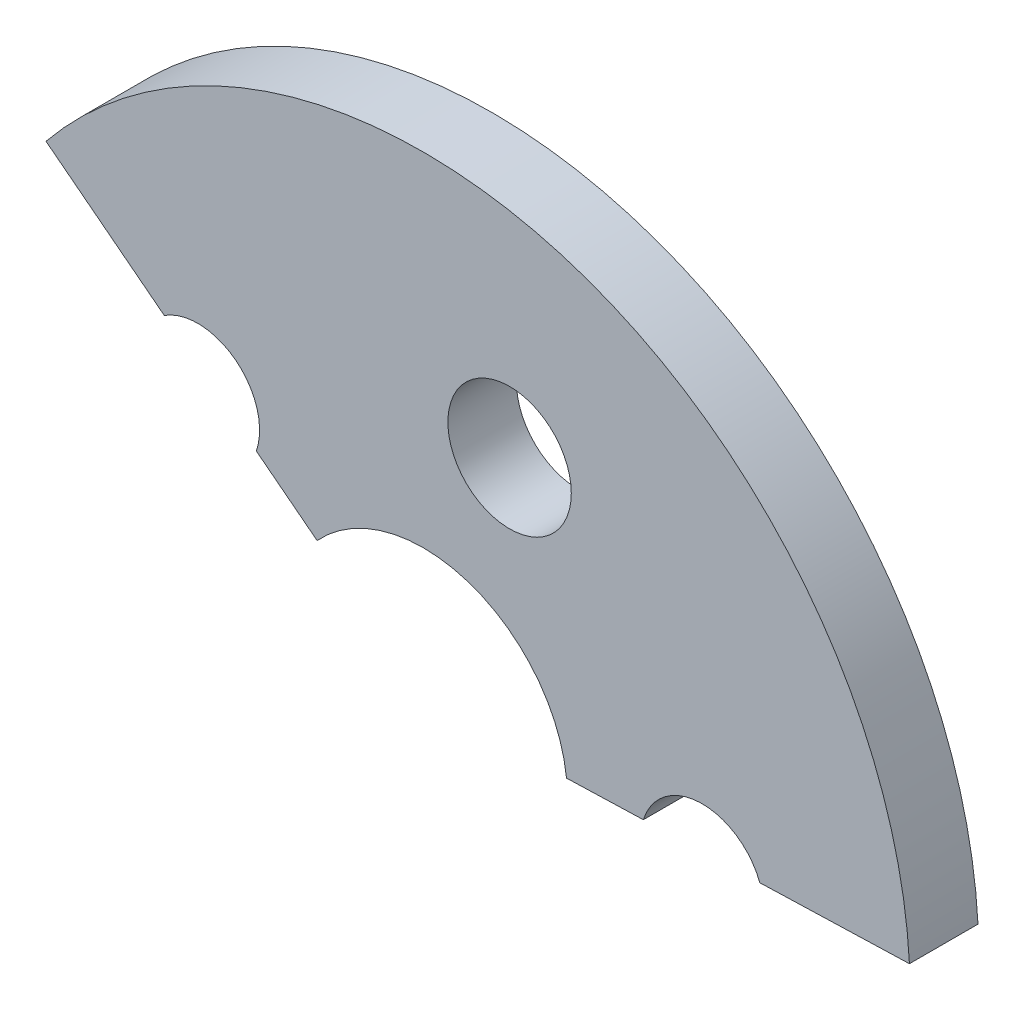
ISO-10303-21;
HEADER;
FILE_DESCRIPTION(('STEP AP214'),'2;1');
FILE_NAME('part.step','',(''),(''),'','','');
FILE_SCHEMA(('AUTOMOTIVE_DESIGN { 1 0 10303 214 1 1 1 1 }'));
ENDSEC;
DATA;
#1=APPLICATION_CONTEXT('core data for automotive mechanical design processes');
#2=APPLICATION_PROTOCOL_DEFINITION('international standard','automotive_design',2000,#1);
#3=PRODUCT_CONTEXT('',#1,'mechanical');
#4=PRODUCT('Part','Part','',(#3));
#5=PRODUCT_RELATED_PRODUCT_CATEGORY('part','',(#4));
#6=PRODUCT_DEFINITION_FORMATION('','',#4);
#7=PRODUCT_DEFINITION_CONTEXT('part definition',#1,'design');
#8=PRODUCT_DEFINITION('design','',#6,#7);
#9=PRODUCT_DEFINITION_SHAPE('','',#8);
#10=(LENGTH_UNIT() NAMED_UNIT(*) SI_UNIT(.MILLI.,.METRE.));
#11=(NAMED_UNIT(*) PLANE_ANGLE_UNIT() SI_UNIT($,.RADIAN.));
#12=(NAMED_UNIT(*) SI_UNIT($,.STERADIAN.) SOLID_ANGLE_UNIT());
#13=UNCERTAINTY_MEASURE_WITH_UNIT(LENGTH_MEASURE(1.E-05),#10,'distance_accuracy_value','');
#14=(GEOMETRIC_REPRESENTATION_CONTEXT(3) GLOBAL_UNCERTAINTY_ASSIGNED_CONTEXT((#13)) GLOBAL_UNIT_ASSIGNED_CONTEXT((#10,
#11,#12)) REPRESENTATION_CONTEXT('',''));
#15=CARTESIAN_POINT('',(0.,0.,0.));
#16=DIRECTION('',(0.,0.,1.));
#17=DIRECTION('',(1.,0.,0.));
#18=AXIS2_PLACEMENT_3D('',#15,#16,#17);
#19=CARTESIAN_POINT('',(45.0166893192371,2.48090865113747,6.35));
#20=DIRECTION('',(-0.0313182896172944,0.999509462053985,0.));
#21=DIRECTION('',(-0.999509462053985,-0.0313182896172945,0.));
#22=AXIS2_PLACEMENT_3D('',#19,#20,#21);
#23=PLANE('',#22);
#24=DIRECTION('',(0.,0.,1.));
#25=VECTOR('',#24,1.);
#26=CARTESIAN_POINT('',(20.3699099311103,1.70863484652068,0.));
#27=LINE('',#26,#25);
#28=CARTESIAN_POINT('',(20.3699099311103,1.70863484652068,0.));
#29=VERTEX_POINT('',#28);
#30=CARTESIAN_POINT('',(20.3699099311103,1.70863484652068,6.35));
#31=VERTEX_POINT('',#30);
#32=EDGE_CURVE('E55',#29,#31,#27,.T.);
#33=ORIENTED_EDGE('',*,*,#32,.T.);
#34=DIRECTION('',(0.999509462053985,0.0313182896172945,0.));
#35=VECTOR('',#34,1.);
#36=CARTESIAN_POINT('',(45.0166893192371,2.48090865113747,6.35));
#37=LINE('',#36,#35);
#38=CARTESIAN_POINT('',(13.2519887109247,1.48560432333908,6.35));
#39=VERTEX_POINT('',#38);
#40=EDGE_CURVE('E195',#39,#31,#37,.T.);
#41=ORIENTED_EDGE('',*,*,#40,.F.);
#42=DIRECTION('',(0.,0.,-1.));
#43=VECTOR('',#42,1.);
#44=CARTESIAN_POINT('',(13.2519887109247,1.48560432333908,6.35));
#45=LINE('',#44,#43);
#46=CARTESIAN_POINT('',(13.2519887109247,1.48560432333908,0.));
#47=VERTEX_POINT('',#46);
#48=EDGE_CURVE('E11',#39,#47,#45,.T.);
#49=ORIENTED_EDGE('',*,*,#48,.T.);
#50=DIRECTION('',(0.999509462053985,0.0313182896172945,0.));
#51=VECTOR('',#50,1.);
#52=CARTESIAN_POINT('',(45.0166893192371,2.48090865113747,0.));
#53=LINE('',#52,#51);
#54=EDGE_CURVE('E134',#47,#29,#53,.T.);
#55=ORIENTED_EDGE('',*,*,#54,.T.);
#56=EDGE_LOOP('',(#33,#41,#49,#55));
#57=FACE_BOUND('',#56,.T.);
#58=ADVANCED_FACE('F39',(#57),#23,.F.);
#59=DIRECTION('',(0.,0.,1.));
#60=VECTOR('',#59,1.);
#61=CARTESIAN_POINT('',(31.159448366082,2.04671057503752,0.));
#62=LINE('',#61,#60);
#63=CARTESIAN_POINT('',(31.159448366082,2.04671057503752,0.));
#64=VERTEX_POINT('',#63);
#65=CARTESIAN_POINT('',(31.159448366082,2.04671057503752,6.35));
#66=VERTEX_POINT('',#65);
#67=EDGE_CURVE('E176',#64,#66,#62,.T.);
#68=ORIENTED_EDGE('',*,*,#67,.F.);
#69=CARTESIAN_POINT('',(45.0166893192371,2.48090865113747,0.));
#70=VERTEX_POINT('',#69);
#71=EDGE_CURVE('E157',#64,#70,#53,.T.);
#72=ORIENTED_EDGE('',*,*,#71,.T.);
#73=DIRECTION('',(0.,0.,-1.));
#74=VECTOR('',#73,1.);
#75=CARTESIAN_POINT('',(45.0166893192371,2.48090865113747,6.35));
#76=LINE('',#75,#74);
#77=CARTESIAN_POINT('',(45.0166893192371,2.48090865113747,6.35));
#78=VERTEX_POINT('',#77);
#79=EDGE_CURVE('E48',#78,#70,#76,.T.);
#80=ORIENTED_EDGE('',*,*,#79,.F.);
#81=EDGE_CURVE('E177',#66,#78,#37,.T.);
#82=ORIENTED_EDGE('',*,*,#81,.F.);
#83=EDGE_LOOP('',(#68,#72,#80,#82));
#84=FACE_BOUND('',#83,.T.);
#85=ADVANCED_FACE('F175',(#84),#23,.F.);
#86=CARTESIAN_POINT('',(-34.9610251723369,28.4672433491412,6.35));
#87=DIRECTION('',(0.612833949857254,0.790211712076173,0.));
#88=DIRECTION('',(-0.790211712076173,0.612833949857254,0.));
#89=AXIS2_PLACEMENT_3D('',#86,#87,#88);
#90=PLANE('',#89);
#91=DIRECTION('',(0.,0.,1.));
#92=VECTOR('',#91,1.);
#93=CARTESIAN_POINT('',(-24.0054969717913,19.9708878569238,0.));
#94=LINE('',#93,#92);
#95=CARTESIAN_POINT('',(-24.0054969717913,19.9708878569238,0.));
#96=VERTEX_POINT('',#95);
#97=CARTESIAN_POINT('',(-24.0054969717913,19.9708878569238,6.35));
#98=VERTEX_POINT('',#97);
#99=EDGE_CURVE('E63',#96,#98,#94,.T.);
#100=ORIENTED_EDGE('',*,*,#99,.T.);
#101=DIRECTION('',(0.790211712076173,-0.612833949857254,0.));
#102=VECTOR('',#101,1.);
#103=CARTESIAN_POINT('',(-34.9610251723369,28.4672433491412,6.35));
#104=LINE('',#103,#102);
#105=CARTESIAN_POINT('',(-34.9610251723369,28.4672433491412,6.35));
#106=VERTEX_POINT('',#105);
#107=EDGE_CURVE('E142',#106,#98,#104,.T.);
#108=ORIENTED_EDGE('',*,*,#107,.F.);
#109=DIRECTION('',(0.,0.,-1.));
#110=VECTOR('',#109,1.);
#111=CARTESIAN_POINT('',(-34.9610251723369,28.4672433491412,6.35));
#112=LINE('',#111,#110);
#113=CARTESIAN_POINT('',(-34.9610251723369,28.4672433491412,0.));
#114=VERTEX_POINT('',#113);
#115=EDGE_CURVE('E141',#106,#114,#112,.T.);
#116=ORIENTED_EDGE('',*,*,#115,.T.);
#117=DIRECTION('',(0.790211712076173,-0.612833949857254,0.));
#118=VECTOR('',#117,1.);
#119=CARTESIAN_POINT('',(-34.9610251723369,28.4672433491412,0.));
#120=LINE('',#119,#118);
#121=EDGE_CURVE('E128',#114,#96,#120,.T.);
#122=ORIENTED_EDGE('',*,*,#121,.T.);
#123=EDGE_LOOP('',(#100,#108,#116,#122));
#124=FACE_BOUND('',#123,.T.);
#125=ADVANCED_FACE('F159',(#124),#90,.F.);
#126=DIRECTION('',(0.,0.,1.));
#127=VECTOR('',#126,1.);
#128=CARTESIAN_POINT('',(-15.4752929438175,13.3554472760488,0.));
#129=LINE('',#128,#127);
#130=CARTESIAN_POINT('',(-15.4752929438175,13.3554472760488,0.));
#131=VERTEX_POINT('',#130);
#132=CARTESIAN_POINT('',(-15.4752929438175,13.3554472760488,6.35));
#133=VERTEX_POINT('',#132);
#134=EDGE_CURVE('E105',#131,#133,#129,.T.);
#135=ORIENTED_EDGE('',*,*,#134,.F.);
#136=CARTESIAN_POINT('',(-9.84786776440252,8.99120267232597,0.));
#137=VERTEX_POINT('',#136);
#138=EDGE_CURVE('E118',#131,#137,#120,.T.);
#139=ORIENTED_EDGE('',*,*,#138,.T.);
#140=DIRECTION('',(0.,0.,-1.));
#141=VECTOR('',#140,1.);
#142=CARTESIAN_POINT('',(-9.84786776440252,8.99120267232597,6.35));
#143=LINE('',#142,#141);
#144=CARTESIAN_POINT('',(-9.84786776440252,8.99120267232597,6.35));
#145=VERTEX_POINT('',#144);
#146=EDGE_CURVE('E138',#145,#137,#143,.T.);
#147=ORIENTED_EDGE('',*,*,#146,.F.);
#148=EDGE_CURVE('E120',#133,#145,#104,.T.);
#149=ORIENTED_EDGE('',*,*,#148,.F.);
#150=EDGE_LOOP('',(#135,#139,#147,#149));
#151=FACE_BOUND('',#150,.T.);
#152=ADVANCED_FACE('F116',(#151),#90,.F.);
#153=CARTESIAN_POINT('',(0.,0.,6.35));
#154=DIRECTION('',(0.,0.,1.));
#155=DIRECTION('',(1.,0.,0.));
#156=AXIS2_PLACEMENT_3D('',#153,#154,#155);
#157=PLANE('',#156);
#158=CARTESIAN_POINT('',(7.97990452808554,24.55962079432,6.35));
#159=DIRECTION('',(0.,0.,1.));
#160=DIRECTION('',(1.,0.,0.));
#161=AXIS2_PLACEMENT_3D('',#158,#159,#160);
#162=CIRCLE('',#161,5.715);
#163=CARTESIAN_POINT('',(13.6949045280855,24.55962079432,6.35));
#164=VERTEX_POINT('',#163);
#165=EDGE_CURVE('E180',#164,#164,#162,.T.);
#166=ORIENTED_EDGE('',*,*,#165,.F.);
#167=EDGE_LOOP('',(#166));
#168=FACE_BOUND('',#167,.T.);
#169=ORIENTED_EDGE('',*,*,#107,.T.);
#170=CARTESIAN_POINT('',(-20.8916612815077,15.1786804016986,6.35));
#171=DIRECTION('',(0.,0.,1.));
#172=DIRECTION('',(1.,0.,0.));
#173=AXIS2_PLACEMENT_3D('',#170,#171,#172);
#174=CIRCLE('',#173,5.715);
#175=EDGE_CURVE('E112',#98,#133,#174,.F.);
#176=ORIENTED_EDGE('',*,*,#175,.T.);
#177=ORIENTED_EDGE('',*,*,#148,.T.);
#178=CARTESIAN_POINT('',(0.,0.,6.35));
#179=DIRECTION('',(0.,0.,-1.));
#180=DIRECTION('',(1.,0.,0.));
#181=AXIS2_PLACEMENT_3D('',#178,#179,#180);
#182=CIRCLE('',#181,13.335);
#183=EDGE_CURVE('E133',#145,#39,#182,.T.);
#184=ORIENTED_EDGE('',*,*,#183,.T.);
#185=ORIENTED_EDGE('',*,*,#40,.T.);
#186=CARTESIAN_POINT('',(25.823513506844,3.33066907387547E-13,6.35));
#187=DIRECTION('',(0.,0.,1.));
#188=DIRECTION('',(1.,0.,0.));
#189=AXIS2_PLACEMENT_3D('',#186,#187,#188);
#190=CIRCLE('',#189,5.715);
#191=EDGE_CURVE('E190',#31,#66,#190,.F.);
#192=ORIENTED_EDGE('',*,*,#191,.T.);
#193=ORIENTED_EDGE('',*,*,#81,.T.);
#194=CARTESIAN_POINT('',(0.,0.,6.35));
#195=DIRECTION('',(0.,0.,1.));
#196=DIRECTION('',(1.,0.,0.));
#197=AXIS2_PLACEMENT_3D('',#194,#195,#196);
#198=CIRCLE('',#197,45.085);
#199=EDGE_CURVE('E153',#78,#106,#198,.T.);
#200=ORIENTED_EDGE('',*,*,#199,.T.);
#201=EDGE_LOOP('',(#169,#176,#177,#184,#185,#192,#193,#200));
#202=FACE_BOUND('',#201,.T.);
#203=ADVANCED_FACE('F200',(#168,#202),#157,.T.);
#204=CARTESIAN_POINT('',(0.,0.,0.));
#205=DIRECTION('',(0.,0.,1.));
#206=DIRECTION('',(1.,0.,0.));
#207=AXIS2_PLACEMENT_3D('',#204,#205,#206);
#208=PLANE('',#207);
#209=CARTESIAN_POINT('',(7.97990452808554,24.55962079432,0.));
#210=DIRECTION('',(0.,0.,1.));
#211=DIRECTION('',(1.,0.,0.));
#212=AXIS2_PLACEMENT_3D('',#209,#210,#211);
#213=CIRCLE('',#212,5.715);
#214=CARTESIAN_POINT('',(13.6949045280855,24.55962079432,0.));
#215=VERTEX_POINT('',#214);
#216=EDGE_CURVE('E185',#215,#215,#213,.T.);
#217=ORIENTED_EDGE('',*,*,#216,.T.);
#218=EDGE_LOOP('',(#217));
#219=FACE_BOUND('',#218,.T.);
#220=CARTESIAN_POINT('',(-20.8916612815077,15.1786804016986,0.));
#221=DIRECTION('',(0.,0.,1.));
#222=DIRECTION('',(1.,0.,0.));
#223=AXIS2_PLACEMENT_3D('',#220,#221,#222);
#224=CIRCLE('',#223,5.715);
#225=EDGE_CURVE('E102',#96,#131,#224,.F.);
#226=ORIENTED_EDGE('',*,*,#225,.F.);
#227=ORIENTED_EDGE('',*,*,#121,.F.);
#228=CARTESIAN_POINT('',(0.,0.,0.));
#229=DIRECTION('',(0.,0.,1.));
#230=DIRECTION('',(1.,0.,0.));
#231=AXIS2_PLACEMENT_3D('',#228,#229,#230);
#232=CIRCLE('',#231,45.085);
#233=EDGE_CURVE('E129',#70,#114,#232,.T.);
#234=ORIENTED_EDGE('',*,*,#233,.F.);
#235=ORIENTED_EDGE('',*,*,#71,.F.);
#236=CARTESIAN_POINT('',(25.823513506844,3.33066907387547E-13,0.));
#237=DIRECTION('',(0.,0.,1.));
#238=DIRECTION('',(1.,0.,0.));
#239=AXIS2_PLACEMENT_3D('',#236,#237,#238);
#240=CIRCLE('',#239,5.715);
#241=EDGE_CURVE('E187',#29,#64,#240,.F.);
#242=ORIENTED_EDGE('',*,*,#241,.F.);
#243=ORIENTED_EDGE('',*,*,#54,.F.);
#244=CARTESIAN_POINT('',(0.,0.,0.));
#245=DIRECTION('',(0.,0.,-1.));
#246=DIRECTION('',(1.,0.,0.));
#247=AXIS2_PLACEMENT_3D('',#244,#245,#246);
#248=CIRCLE('',#247,13.335);
#249=EDGE_CURVE('E122',#137,#47,#248,.T.);
#250=ORIENTED_EDGE('',*,*,#249,.F.);
#251=ORIENTED_EDGE('',*,*,#138,.F.);
#252=EDGE_LOOP('',(#226,#227,#234,#235,#242,#243,#250,#251));
#253=FACE_BOUND('',#252,.T.);
#254=ADVANCED_FACE('F125',(#219,#253),#208,.F.);
#255=CARTESIAN_POINT('',(0.,0.,6.35));
#256=DIRECTION('',(0.,0.,-1.));
#257=DIRECTION('',(-1.,0.,0.));
#258=AXIS2_PLACEMENT_3D('',#255,#256,#257);
#259=CYLINDRICAL_SURFACE('',#258,13.335);
#260=ORIENTED_EDGE('',*,*,#249,.T.);
#261=ORIENTED_EDGE('',*,*,#48,.F.);
#262=ORIENTED_EDGE('',*,*,#183,.F.);
#263=ORIENTED_EDGE('',*,*,#146,.T.);
#264=EDGE_LOOP('',(#260,#261,#262,#263));
#265=FACE_BOUND('',#264,.T.);
#266=ADVANCED_FACE('F41',(#265),#259,.F.);
#267=CARTESIAN_POINT('',(0.,0.,6.35));
#268=DIRECTION('',(0.,0.,-1.));
#269=DIRECTION('',(-1.,0.,0.));
#270=AXIS2_PLACEMENT_3D('',#267,#268,#269);
#271=CYLINDRICAL_SURFACE('',#270,45.085);
#272=ORIENTED_EDGE('',*,*,#233,.T.);
#273=ORIENTED_EDGE('',*,*,#115,.F.);
#274=ORIENTED_EDGE('',*,*,#199,.F.);
#275=ORIENTED_EDGE('',*,*,#79,.T.);
#276=EDGE_LOOP('',(#272,#273,#274,#275));
#277=FACE_BOUND('',#276,.T.);
#278=ADVANCED_FACE('F151',(#277),#271,.T.);
#279=CARTESIAN_POINT('',(25.823513506844,3.33066907387547E-13,0.));
#280=DIRECTION('',(0.,0.,1.));
#281=DIRECTION('',(1.,0.,0.));
#282=AXIS2_PLACEMENT_3D('',#279,#280,#281);
#283=CYLINDRICAL_SURFACE('',#282,5.715);
#284=ORIENTED_EDGE('',*,*,#191,.F.);
#285=ORIENTED_EDGE('',*,*,#32,.F.);
#286=ORIENTED_EDGE('',*,*,#241,.T.);
#287=ORIENTED_EDGE('',*,*,#67,.T.);
#288=EDGE_LOOP('',(#284,#285,#286,#287));
#289=FACE_BOUND('',#288,.T.);
#290=ADVANCED_FACE('F220',(#289),#283,.F.);
#291=CARTESIAN_POINT('',(7.97990452808554,24.55962079432,0.));
#292=DIRECTION('',(0.,0.,1.));
#293=DIRECTION('',(1.,0.,0.));
#294=AXIS2_PLACEMENT_3D('',#291,#292,#293);
#295=CYLINDRICAL_SURFACE('',#294,5.715);
#296=ORIENTED_EDGE('',*,*,#216,.F.);
#297=EDGE_LOOP('',(#296));
#298=FACE_BOUND('',#297,.T.);
#299=ORIENTED_EDGE('',*,*,#165,.T.);
#300=EDGE_LOOP('',(#299));
#301=FACE_BOUND('',#300,.T.);
#302=ADVANCED_FACE('F231',(#298,#301),#295,.F.);
#303=CARTESIAN_POINT('',(-20.8916612815077,15.1786804016986,0.));
#304=DIRECTION('',(0.,0.,1.));
#305=DIRECTION('',(1.,0.,0.));
#306=AXIS2_PLACEMENT_3D('',#303,#304,#305);
#307=CYLINDRICAL_SURFACE('',#306,5.715);
#308=ORIENTED_EDGE('',*,*,#175,.F.);
#309=ORIENTED_EDGE('',*,*,#99,.F.);
#310=ORIENTED_EDGE('',*,*,#225,.T.);
#311=ORIENTED_EDGE('',*,*,#134,.T.);
#312=EDGE_LOOP('',(#308,#309,#310,#311));
#313=FACE_BOUND('',#312,.T.);
#314=ADVANCED_FACE('F104',(#313),#307,.F.);
#315=CLOSED_SHELL('',(#58,#85,#125,#152,#203,#254,#266,#278,#290,#302,#314));
#316=MANIFOLD_SOLID_BREP('B2',#315);
#317=ADVANCED_BREP_SHAPE_REPRESENTATION('',(#18,#316),#14);
#318=SHAPE_DEFINITION_REPRESENTATION(#9,#317);
ENDSEC;
END-ISO-10303-21;
